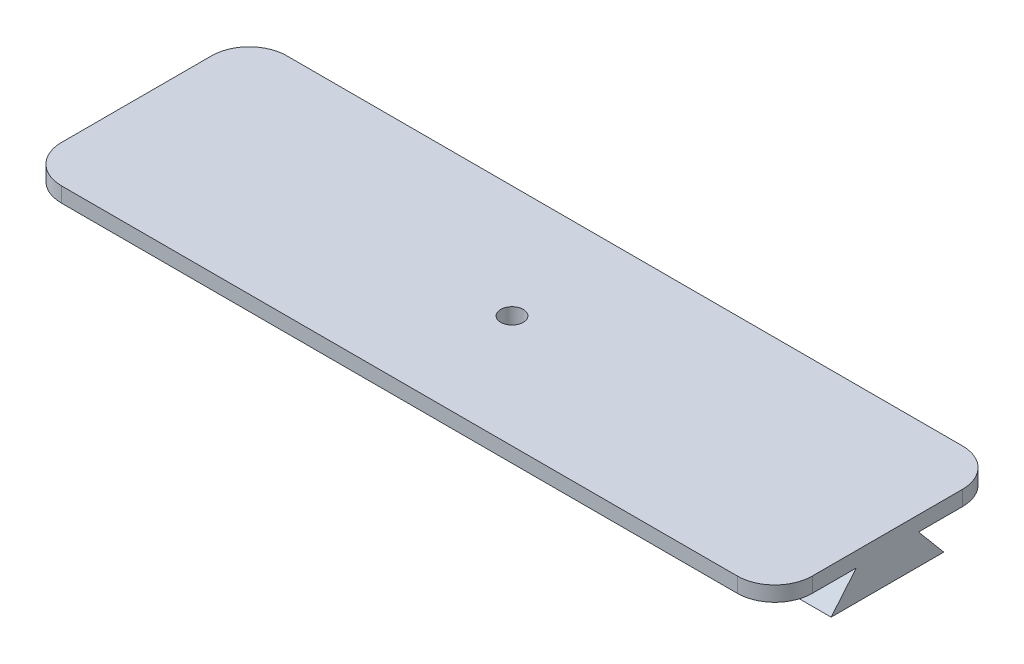
ISO-10303-21;
HEADER;
FILE_DESCRIPTION(('STEP AP214'),'2;1');
FILE_NAME('part.step','',(''),(''),'','','');
FILE_SCHEMA(('AUTOMOTIVE_DESIGN { 1 0 10303 214 1 1 1 1 }'));
ENDSEC;
DATA;
#1=APPLICATION_CONTEXT('core data for automotive mechanical design processes');
#2=APPLICATION_PROTOCOL_DEFINITION('international standard','automotive_design',2000,#1);
#3=PRODUCT_CONTEXT('',#1,'mechanical');
#4=PRODUCT('Part','Part','',(#3));
#5=PRODUCT_RELATED_PRODUCT_CATEGORY('part','',(#4));
#6=PRODUCT_DEFINITION_FORMATION('','',#4);
#7=PRODUCT_DEFINITION_CONTEXT('part definition',#1,'design');
#8=PRODUCT_DEFINITION('design','',#6,#7);
#9=PRODUCT_DEFINITION_SHAPE('','',#8);
#10=(LENGTH_UNIT() NAMED_UNIT(*) SI_UNIT(.MILLI.,.METRE.));
#11=(NAMED_UNIT(*) PLANE_ANGLE_UNIT() SI_UNIT($,.RADIAN.));
#12=(NAMED_UNIT(*) SI_UNIT($,.STERADIAN.) SOLID_ANGLE_UNIT());
#13=UNCERTAINTY_MEASURE_WITH_UNIT(LENGTH_MEASURE(1.E-05),#10,'distance_accuracy_value','');
#14=(GEOMETRIC_REPRESENTATION_CONTEXT(3) GLOBAL_UNCERTAINTY_ASSIGNED_CONTEXT((#13)) GLOBAL_UNIT_ASSIGNED_CONTEXT((#10,
#11,#12)) REPRESENTATION_CONTEXT('',''));
#15=CARTESIAN_POINT('',(0.,0.,0.));
#16=DIRECTION('',(0.,0.,1.));
#17=DIRECTION('',(1.,0.,0.));
#18=AXIS2_PLACEMENT_3D('',#15,#16,#17);
#19=CARTESIAN_POINT('',(0.,6.,0.));
#20=DIRECTION('',(1.,0.,0.));
#21=DIRECTION('',(0.,0.,-1.));
#22=AXIS2_PLACEMENT_3D('',#19,#20,#21);
#23=PLANE('',#22);
#24=DIRECTION('',(0.,0.,1.));
#25=VECTOR('',#24,1.);
#26=CARTESIAN_POINT('',(0.,4.,30.));
#27=LINE('',#26,#25);
#28=CARTESIAN_POINT('',(0.,4.,19.1436014752909));
#29=VERTEX_POINT('',#28);
#30=CARTESIAN_POINT('',(0.,4.,25.));
#31=VERTEX_POINT('',#30);
#32=EDGE_CURVE('E187',#29,#31,#27,.T.);
#33=ORIENTED_EDGE('',*,*,#32,.T.);
#34=DIRECTION('',(0.,-1.,0.));
#35=VECTOR('',#34,1.);
#36=CARTESIAN_POINT('',(0.,6.,25.));
#37=LINE('',#36,#35);
#38=CARTESIAN_POINT('',(0.,6.,25.));
#39=VERTEX_POINT('',#38);
#40=EDGE_CURVE('E11',#31,#39,#37,.F.);
#41=ORIENTED_EDGE('',*,*,#40,.T.);
#42=DIRECTION('',(0.,0.,1.));
#43=VECTOR('',#42,1.);
#44=CARTESIAN_POINT('',(0.,6.,0.));
#45=LINE('',#44,#43);
#46=CARTESIAN_POINT('',(0.,6.,5.));
#47=VERTEX_POINT('',#46);
#48=EDGE_CURVE('E195',#47,#39,#45,.T.);
#49=ORIENTED_EDGE('',*,*,#48,.F.);
#50=DIRECTION('',(0.,-1.,0.));
#51=VECTOR('',#50,1.);
#52=CARTESIAN_POINT('',(0.,6.,5.));
#53=LINE('',#52,#51);
#54=CARTESIAN_POINT('',(0.,4.,5.));
#55=VERTEX_POINT('',#54);
#56=EDGE_CURVE('E139',#47,#55,#53,.T.);
#57=ORIENTED_EDGE('',*,*,#56,.T.);
#58=DIRECTION('',(0.,0.,1.));
#59=VECTOR('',#58,1.);
#60=CARTESIAN_POINT('',(0.,4.,0.));
#61=LINE('',#60,#59);
#62=CARTESIAN_POINT('',(0.,4.,10.8563985247091));
#63=VERTEX_POINT('',#62);
#64=EDGE_CURVE('E131',#55,#63,#61,.T.);
#65=ORIENTED_EDGE('',*,*,#64,.T.);
#66=DIRECTION('',(0.,-0.766044443118979,-0.642787609686538));
#67=VECTOR('',#66,1.);
#68=CARTESIAN_POINT('',(0.,0.,7.5));
#69=LINE('',#68,#67);
#70=CARTESIAN_POINT('',(0.,0.,7.5));
#71=VERTEX_POINT('',#70);
#72=EDGE_CURVE('E135',#63,#71,#69,.T.);
#73=ORIENTED_EDGE('',*,*,#72,.T.);
#74=DIRECTION('',(0.,0.,1.));
#75=VECTOR('',#74,1.);
#76=CARTESIAN_POINT('',(0.,0.,0.));
#77=LINE('',#76,#75);
#78=CARTESIAN_POINT('',(0.,0.,22.5));
#79=VERTEX_POINT('',#78);
#80=EDGE_CURVE('E169',#71,#79,#77,.T.);
#81=ORIENTED_EDGE('',*,*,#80,.T.);
#82=DIRECTION('',(0.,0.766044443118979,-0.642787609686538));
#83=VECTOR('',#82,1.);
#84=CARTESIAN_POINT('',(0.,0.,22.5));
#85=LINE('',#84,#83);
#86=EDGE_CURVE('E175',#79,#29,#85,.T.);
#87=ORIENTED_EDGE('',*,*,#86,.T.);
#88=EDGE_LOOP('',(#33,#41,#49,#57,#65,#73,#81,#87));
#89=FACE_BOUND('',#88,.T.);
#90=ADVANCED_FACE('F41',(#89),#23,.F.);
#91=CARTESIAN_POINT('',(0.,6.,30.));
#92=DIRECTION('',(0.,0.,-1.));
#93=DIRECTION('',(-1.,0.,0.));
#94=AXIS2_PLACEMENT_3D('',#91,#92,#93);
#95=PLANE('',#94);
#96=DIRECTION('',(1.,0.,0.));
#97=VECTOR('',#96,1.);
#98=CARTESIAN_POINT('',(0.,4.,30.));
#99=LINE('',#98,#97);
#100=CARTESIAN_POINT('',(5.,4.,30.));
#101=VERTEX_POINT('',#100);
#102=CARTESIAN_POINT('',(95.,4.,30.));
#103=VERTEX_POINT('',#102);
#104=EDGE_CURVE('E172',#101,#103,#99,.T.);
#105=ORIENTED_EDGE('',*,*,#104,.T.);
#106=DIRECTION('',(0.,-1.,0.));
#107=VECTOR('',#106,1.);
#108=CARTESIAN_POINT('',(95.,6.,30.));
#109=LINE('',#108,#107);
#110=CARTESIAN_POINT('',(95.,6.,30.));
#111=VERTEX_POINT('',#110);
#112=EDGE_CURVE('E50',#103,#111,#109,.F.);
#113=ORIENTED_EDGE('',*,*,#112,.T.);
#114=DIRECTION('',(1.,0.,0.));
#115=VECTOR('',#114,1.);
#116=CARTESIAN_POINT('',(0.,6.,30.));
#117=LINE('',#116,#115);
#118=CARTESIAN_POINT('',(5.,6.,30.));
#119=VERTEX_POINT('',#118);
#120=EDGE_CURVE('E199',#119,#111,#117,.T.);
#121=ORIENTED_EDGE('',*,*,#120,.F.);
#122=DIRECTION('',(0.,-1.,0.));
#123=VECTOR('',#122,1.);
#124=CARTESIAN_POINT('',(5.,6.,30.));
#125=LINE('',#124,#123);
#126=EDGE_CURVE('E255',#119,#101,#125,.T.);
#127=ORIENTED_EDGE('',*,*,#126,.T.);
#128=EDGE_LOOP('',(#105,#113,#121,#127));
#129=FACE_BOUND('',#128,.T.);
#130=ADVANCED_FACE('F262',(#129),#95,.F.);
#131=CARTESIAN_POINT('',(100.,6.,0.));
#132=DIRECTION('',(-1.,0.,0.));
#133=DIRECTION('',(0.,0.,1.));
#134=AXIS2_PLACEMENT_3D('',#131,#132,#133);
#135=PLANE('',#134);
#136=DIRECTION('',(0.,0.,1.));
#137=VECTOR('',#136,1.);
#138=CARTESIAN_POINT('',(100.,4.,0.));
#139=LINE('',#138,#137);
#140=CARTESIAN_POINT('',(100.,4.,5.));
#141=VERTEX_POINT('',#140);
#142=CARTESIAN_POINT('',(100.,4.,10.8563985247091));
#143=VERTEX_POINT('',#142);
#144=EDGE_CURVE('E149',#141,#143,#139,.T.);
#145=ORIENTED_EDGE('',*,*,#144,.F.);
#146=DIRECTION('',(0.,-1.,0.));
#147=VECTOR('',#146,1.);
#148=CARTESIAN_POINT('',(100.,6.,5.));
#149=LINE('',#148,#147);
#150=CARTESIAN_POINT('',(100.,6.,5.));
#151=VERTEX_POINT('',#150);
#152=EDGE_CURVE('E239',#141,#151,#149,.F.);
#153=ORIENTED_EDGE('',*,*,#152,.T.);
#154=DIRECTION('',(0.,0.,-1.));
#155=VECTOR('',#154,1.);
#156=CARTESIAN_POINT('',(100.,6.,0.));
#157=LINE('',#156,#155);
#158=CARTESIAN_POINT('',(100.,6.,25.));
#159=VERTEX_POINT('',#158);
#160=EDGE_CURVE('E204',#159,#151,#157,.T.);
#161=ORIENTED_EDGE('',*,*,#160,.F.);
#162=DIRECTION('',(0.,-1.,0.));
#163=VECTOR('',#162,1.);
#164=CARTESIAN_POINT('',(100.,6.,25.));
#165=LINE('',#164,#163);
#166=CARTESIAN_POINT('',(100.,4.,25.));
#167=VERTEX_POINT('',#166);
#168=EDGE_CURVE('E235',#159,#167,#165,.T.);
#169=ORIENTED_EDGE('',*,*,#168,.T.);
#170=DIRECTION('',(0.,0.,1.));
#171=VECTOR('',#170,1.);
#172=CARTESIAN_POINT('',(100.,4.,30.));
#173=LINE('',#172,#171);
#174=CARTESIAN_POINT('',(100.,4.,19.1436014752909));
#175=VERTEX_POINT('',#174);
#176=EDGE_CURVE('E163',#175,#167,#173,.T.);
#177=ORIENTED_EDGE('',*,*,#176,.F.);
#178=DIRECTION('',(0.,0.766044443118979,-0.642787609686538));
#179=VECTOR('',#178,1.);
#180=CARTESIAN_POINT('',(100.,0.,22.5));
#181=LINE('',#180,#179);
#182=CARTESIAN_POINT('',(100.,0.,22.5));
#183=VERTEX_POINT('',#182);
#184=EDGE_CURVE('E183',#183,#175,#181,.T.);
#185=ORIENTED_EDGE('',*,*,#184,.F.);
#186=DIRECTION('',(0.,0.,-1.));
#187=VECTOR('',#186,1.);
#188=CARTESIAN_POINT('',(100.,0.,0.));
#189=LINE('',#188,#187);
#190=CARTESIAN_POINT('',(100.,0.,7.5));
#191=VERTEX_POINT('',#190);
#192=EDGE_CURVE('E200',#183,#191,#189,.T.);
#193=ORIENTED_EDGE('',*,*,#192,.T.);
#194=DIRECTION('',(0.,-0.766044443118979,-0.642787609686538));
#195=VECTOR('',#194,1.);
#196=CARTESIAN_POINT('',(100.,0.,7.5));
#197=LINE('',#196,#195);
#198=EDGE_CURVE('E142',#143,#191,#197,.T.);
#199=ORIENTED_EDGE('',*,*,#198,.F.);
#200=EDGE_LOOP('',(#145,#153,#161,#169,#177,#185,#193,#199));
#201=FACE_BOUND('',#200,.T.);
#202=ADVANCED_FACE('F274',(#201),#135,.F.);
#203=CARTESIAN_POINT('',(0.,6.,0.));
#204=DIRECTION('',(0.,0.,1.));
#205=DIRECTION('',(1.,0.,0.));
#206=AXIS2_PLACEMENT_3D('',#203,#204,#205);
#207=PLANE('',#206);
#208=DIRECTION('',(-1.,0.,0.));
#209=VECTOR('',#208,1.);
#210=CARTESIAN_POINT('',(0.,6.,0.));
#211=LINE('',#210,#209);
#212=CARTESIAN_POINT('',(95.,6.,0.));
#213=VERTEX_POINT('',#212);
#214=CARTESIAN_POINT('',(5.,6.,0.));
#215=VERTEX_POINT('',#214);
#216=EDGE_CURVE('E208',#213,#215,#211,.T.);
#217=ORIENTED_EDGE('',*,*,#216,.F.);
#218=DIRECTION('',(0.,-1.,0.));
#219=VECTOR('',#218,1.);
#220=CARTESIAN_POINT('',(95.,6.,0.));
#221=LINE('',#220,#219);
#222=CARTESIAN_POINT('',(95.,4.,0.));
#223=VERTEX_POINT('',#222);
#224=EDGE_CURVE('E228',#213,#223,#221,.T.);
#225=ORIENTED_EDGE('',*,*,#224,.T.);
#226=DIRECTION('',(1.,0.,0.));
#227=VECTOR('',#226,1.);
#228=CARTESIAN_POINT('',(0.,4.,0.));
#229=LINE('',#228,#227);
#230=CARTESIAN_POINT('',(5.,4.,0.));
#231=VERTEX_POINT('',#230);
#232=EDGE_CURVE('E166',#231,#223,#229,.T.);
#233=ORIENTED_EDGE('',*,*,#232,.F.);
#234=DIRECTION('',(0.,-1.,0.));
#235=VECTOR('',#234,1.);
#236=CARTESIAN_POINT('',(5.,6.,0.));
#237=LINE('',#236,#235);
#238=EDGE_CURVE('E221',#231,#215,#237,.F.);
#239=ORIENTED_EDGE('',*,*,#238,.T.);
#240=EDGE_LOOP('',(#217,#225,#233,#239));
#241=FACE_BOUND('',#240,.T.);
#242=ADVANCED_FACE('F312',(#241),#207,.F.);
#243=CARTESIAN_POINT('',(0.,6.,0.));
#244=DIRECTION('',(0.,1.,0.));
#245=DIRECTION('',(0.,0.,1.));
#246=AXIS2_PLACEMENT_3D('',#243,#244,#245);
#247=PLANE('',#246);
#248=CARTESIAN_POINT('',(50.,6.,15.));
#249=DIRECTION('',(0.,1.,0.));
#250=DIRECTION('',(0.,0.,1.));
#251=AXIS2_PLACEMENT_3D('',#248,#249,#250);
#252=CIRCLE('',#251,1.5);
#253=CARTESIAN_POINT('',(50.,6.,16.5));
#254=VERTEX_POINT('',#253);
#255=EDGE_CURVE('E345',#254,#254,#252,.T.);
#256=ORIENTED_EDGE('',*,*,#255,.F.);
#257=EDGE_LOOP('',(#256));
#258=FACE_BOUND('',#257,.T.);
#259=ORIENTED_EDGE('',*,*,#160,.T.);
#260=CARTESIAN_POINT('',(95.,6.,5.));
#261=DIRECTION('',(0.,1.,0.));
#262=DIRECTION('',(0.,0.,1.));
#263=AXIS2_PLACEMENT_3D('',#260,#261,#262);
#264=CIRCLE('',#263,5.);
#265=EDGE_CURVE('E248',#151,#213,#264,.T.);
#266=ORIENTED_EDGE('',*,*,#265,.T.);
#267=ORIENTED_EDGE('',*,*,#216,.T.);
#268=CARTESIAN_POINT('',(5.,6.,5.));
#269=DIRECTION('',(0.,1.,0.));
#270=DIRECTION('',(0.,0.,1.));
#271=AXIS2_PLACEMENT_3D('',#268,#269,#270);
#272=CIRCLE('',#271,5.);
#273=EDGE_CURVE('E225',#215,#47,#272,.T.);
#274=ORIENTED_EDGE('',*,*,#273,.T.);
#275=ORIENTED_EDGE('',*,*,#48,.T.);
#276=CARTESIAN_POINT('',(5.,6.,25.));
#277=DIRECTION('',(0.,1.,0.));
#278=DIRECTION('',(0.,0.,1.));
#279=AXIS2_PLACEMENT_3D('',#276,#277,#278);
#280=CIRCLE('',#279,5.);
#281=EDGE_CURVE('E242',#39,#119,#280,.T.);
#282=ORIENTED_EDGE('',*,*,#281,.T.);
#283=ORIENTED_EDGE('',*,*,#120,.T.);
#284=CARTESIAN_POINT('',(95.,6.,25.));
#285=DIRECTION('',(0.,1.,0.));
#286=DIRECTION('',(0.,0.,1.));
#287=AXIS2_PLACEMENT_3D('',#284,#285,#286);
#288=CIRCLE('',#287,5.);
#289=EDGE_CURVE('E245',#111,#159,#288,.T.);
#290=ORIENTED_EDGE('',*,*,#289,.T.);
#291=EDGE_LOOP('',(#259,#266,#267,#274,#275,#282,#283,#290));
#292=FACE_BOUND('',#291,.T.);
#293=ADVANCED_FACE('F267',(#258,#292),#247,.T.);
#294=CARTESIAN_POINT('',(0.,0.,0.));
#295=DIRECTION('',(0.,1.,0.));
#296=DIRECTION('',(0.,0.,1.));
#297=AXIS2_PLACEMENT_3D('',#294,#295,#296);
#298=PLANE('',#297);
#299=CARTESIAN_POINT('',(50.,0.,15.));
#300=DIRECTION('',(0.,1.,0.));
#301=DIRECTION('',(0.,0.,1.));
#302=AXIS2_PLACEMENT_3D('',#299,#300,#301);
#303=CIRCLE('',#302,1.5);
#304=CARTESIAN_POINT('',(50.,0.,16.5));
#305=VERTEX_POINT('',#304);
#306=EDGE_CURVE('E182',#305,#305,#303,.T.);
#307=ORIENTED_EDGE('',*,*,#306,.T.);
#308=EDGE_LOOP('',(#307));
#309=FACE_BOUND('',#308,.T.);
#310=ORIENTED_EDGE('',*,*,#80,.F.);
#311=DIRECTION('',(1.,0.,0.));
#312=VECTOR('',#311,1.);
#313=CARTESIAN_POINT('',(0.,0.,7.5));
#314=LINE('',#313,#312);
#315=EDGE_CURVE('E153',#71,#191,#314,.T.);
#316=ORIENTED_EDGE('',*,*,#315,.T.);
#317=ORIENTED_EDGE('',*,*,#192,.F.);
#318=DIRECTION('',(1.,0.,0.));
#319=VECTOR('',#318,1.);
#320=CARTESIAN_POINT('',(0.,0.,22.5));
#321=LINE('',#320,#319);
#322=EDGE_CURVE('E176',#79,#183,#321,.T.);
#323=ORIENTED_EDGE('',*,*,#322,.F.);
#324=EDGE_LOOP('',(#310,#316,#317,#323));
#325=FACE_BOUND('',#324,.T.);
#326=ADVANCED_FACE('F282',(#309,#325),#298,.F.);
#327=CARTESIAN_POINT('',(0.,4.,30.));
#328=DIRECTION('',(0.,1.,0.));
#329=DIRECTION('',(0.,0.,1.));
#330=AXIS2_PLACEMENT_3D('',#327,#328,#329);
#331=PLANE('',#330);
#332=ORIENTED_EDGE('',*,*,#176,.T.);
#333=CARTESIAN_POINT('',(95.,4.,25.));
#334=DIRECTION('',(0.,1.,0.));
#335=DIRECTION('',(0.,0.,1.));
#336=AXIS2_PLACEMENT_3D('',#333,#334,#335);
#337=CIRCLE('',#336,5.);
#338=EDGE_CURVE('E63',#167,#103,#337,.F.);
#339=ORIENTED_EDGE('',*,*,#338,.T.);
#340=ORIENTED_EDGE('',*,*,#104,.F.);
#341=CARTESIAN_POINT('',(5.,4.,25.));
#342=DIRECTION('',(0.,1.,0.));
#343=DIRECTION('',(0.,0.,1.));
#344=AXIS2_PLACEMENT_3D('',#341,#342,#343);
#345=CIRCLE('',#344,5.);
#346=EDGE_CURVE('E57',#101,#31,#345,.F.);
#347=ORIENTED_EDGE('',*,*,#346,.T.);
#348=ORIENTED_EDGE('',*,*,#32,.F.);
#349=DIRECTION('',(1.,0.,0.));
#350=VECTOR('',#349,1.);
#351=CARTESIAN_POINT('',(0.,4.,19.1436014752909));
#352=LINE('',#351,#350);
#353=EDGE_CURVE('E179',#29,#175,#352,.T.);
#354=ORIENTED_EDGE('',*,*,#353,.T.);
#355=EDGE_LOOP('',(#332,#339,#340,#347,#348,#354));
#356=FACE_BOUND('',#355,.T.);
#357=ADVANCED_FACE('F276',(#356),#331,.F.);
#358=CARTESIAN_POINT('',(0.,0.,22.5));
#359=DIRECTION('',(0.,-0.642787609686538,-0.766044443118979));
#360=DIRECTION('',(0.,0.766044443118979,-0.642787609686538));
#361=AXIS2_PLACEMENT_3D('',#358,#359,#360);
#362=PLANE('',#361);
#363=ORIENTED_EDGE('',*,*,#184,.T.);
#364=ORIENTED_EDGE('',*,*,#353,.F.);
#365=ORIENTED_EDGE('',*,*,#86,.F.);
#366=ORIENTED_EDGE('',*,*,#322,.T.);
#367=EDGE_LOOP('',(#363,#364,#365,#366));
#368=FACE_BOUND('',#367,.T.);
#369=ADVANCED_FACE('F278',(#368),#362,.F.);
#370=CARTESIAN_POINT('',(0.,4.,0.));
#371=DIRECTION('',(0.,1.,0.));
#372=DIRECTION('',(0.,0.,1.));
#373=AXIS2_PLACEMENT_3D('',#370,#371,#372);
#374=PLANE('',#373);
#375=ORIENTED_EDGE('',*,*,#232,.T.);
#376=CARTESIAN_POINT('',(95.,4.,5.));
#377=DIRECTION('',(0.,1.,0.));
#378=DIRECTION('',(0.,0.,1.));
#379=AXIS2_PLACEMENT_3D('',#376,#377,#378);
#380=CIRCLE('',#379,5.);
#381=EDGE_CURVE('E232',#223,#141,#380,.F.);
#382=ORIENTED_EDGE('',*,*,#381,.T.);
#383=ORIENTED_EDGE('',*,*,#144,.T.);
#384=DIRECTION('',(1.,0.,0.));
#385=VECTOR('',#384,1.);
#386=CARTESIAN_POINT('',(0.,4.,10.8563985247091));
#387=LINE('',#386,#385);
#388=EDGE_CURVE('E145',#63,#143,#387,.T.);
#389=ORIENTED_EDGE('',*,*,#388,.F.);
#390=ORIENTED_EDGE('',*,*,#64,.F.);
#391=CARTESIAN_POINT('',(5.,4.,5.));
#392=DIRECTION('',(0.,1.,0.));
#393=DIRECTION('',(0.,0.,1.));
#394=AXIS2_PLACEMENT_3D('',#391,#392,#393);
#395=CIRCLE('',#394,5.);
#396=EDGE_CURVE('E218',#55,#231,#395,.F.);
#397=ORIENTED_EDGE('',*,*,#396,.T.);
#398=EDGE_LOOP('',(#375,#382,#383,#389,#390,#397));
#399=FACE_BOUND('',#398,.T.);
#400=ADVANCED_FACE('F147',(#399),#374,.F.);
#401=CARTESIAN_POINT('',(0.,0.,7.5));
#402=DIRECTION('',(0.,-0.642787609686538,0.766044443118979));
#403=DIRECTION('',(0.,-0.766044443118979,-0.642787609686538));
#404=AXIS2_PLACEMENT_3D('',#401,#402,#403);
#405=PLANE('',#404);
#406=ORIENTED_EDGE('',*,*,#198,.T.);
#407=ORIENTED_EDGE('',*,*,#315,.F.);
#408=ORIENTED_EDGE('',*,*,#72,.F.);
#409=ORIENTED_EDGE('',*,*,#388,.T.);
#410=EDGE_LOOP('',(#406,#407,#408,#409));
#411=FACE_BOUND('',#410,.T.);
#412=ADVANCED_FACE('F155',(#411),#405,.F.);
#413=CARTESIAN_POINT('',(50.,0.,15.));
#414=DIRECTION('',(0.,1.,0.));
#415=DIRECTION('',(0.,0.,1.));
#416=AXIS2_PLACEMENT_3D('',#413,#414,#415);
#417=CYLINDRICAL_SURFACE('',#416,1.5);
#418=ORIENTED_EDGE('',*,*,#306,.F.);
#419=EDGE_LOOP('',(#418));
#420=FACE_BOUND('',#419,.T.);
#421=ORIENTED_EDGE('',*,*,#255,.T.);
#422=EDGE_LOOP('',(#421));
#423=FACE_BOUND('',#422,.T.);
#424=ADVANCED_FACE('F301',(#420,#423),#417,.F.);
#425=CARTESIAN_POINT('',(5.,6.,5.));
#426=DIRECTION('',(0.,-1.,0.));
#427=DIRECTION('',(0.,0.,-1.));
#428=AXIS2_PLACEMENT_3D('',#425,#426,#427);
#429=CYLINDRICAL_SURFACE('',#428,5.);
#430=ORIENTED_EDGE('',*,*,#273,.F.);
#431=ORIENTED_EDGE('',*,*,#238,.F.);
#432=ORIENTED_EDGE('',*,*,#396,.F.);
#433=ORIENTED_EDGE('',*,*,#56,.F.);
#434=EDGE_LOOP('',(#430,#431,#432,#433));
#435=FACE_BOUND('',#434,.T.);
#436=ADVANCED_FACE('F298',(#435),#429,.T.);
#437=CARTESIAN_POINT('',(95.,6.,5.));
#438=DIRECTION('',(0.,-1.,0.));
#439=DIRECTION('',(0.,0.,-1.));
#440=AXIS2_PLACEMENT_3D('',#437,#438,#439);
#441=CYLINDRICAL_SURFACE('',#440,5.);
#442=ORIENTED_EDGE('',*,*,#265,.F.);
#443=ORIENTED_EDGE('',*,*,#152,.F.);
#444=ORIENTED_EDGE('',*,*,#381,.F.);
#445=ORIENTED_EDGE('',*,*,#224,.F.);
#446=EDGE_LOOP('',(#442,#443,#444,#445));
#447=FACE_BOUND('',#446,.T.);
#448=ADVANCED_FACE('F289',(#447),#441,.T.);
#449=CARTESIAN_POINT('',(95.,6.,25.));
#450=DIRECTION('',(0.,-1.,0.));
#451=DIRECTION('',(0.,0.,-1.));
#452=AXIS2_PLACEMENT_3D('',#449,#450,#451);
#453=CYLINDRICAL_SURFACE('',#452,5.);
#454=ORIENTED_EDGE('',*,*,#289,.F.);
#455=ORIENTED_EDGE('',*,*,#112,.F.);
#456=ORIENTED_EDGE('',*,*,#338,.F.);
#457=ORIENTED_EDGE('',*,*,#168,.F.);
#458=EDGE_LOOP('',(#454,#455,#456,#457));
#459=FACE_BOUND('',#458,.T.);
#460=ADVANCED_FACE('F271',(#459),#453,.T.);
#461=CARTESIAN_POINT('',(5.,6.,25.));
#462=DIRECTION('',(0.,-1.,0.));
#463=DIRECTION('',(0.,0.,-1.));
#464=AXIS2_PLACEMENT_3D('',#461,#462,#463);
#465=CYLINDRICAL_SURFACE('',#464,5.);
#466=ORIENTED_EDGE('',*,*,#281,.F.);
#467=ORIENTED_EDGE('',*,*,#40,.F.);
#468=ORIENTED_EDGE('',*,*,#346,.F.);
#469=ORIENTED_EDGE('',*,*,#126,.F.);
#470=EDGE_LOOP('',(#466,#467,#468,#469));
#471=FACE_BOUND('',#470,.T.);
#472=ADVANCED_FACE('F43',(#471),#465,.T.);
#473=CLOSED_SHELL('',(#90,#130,#202,#242,#293,#326,#357,#369,#400,#412,#424,#436,#448,#460,#472));
#474=MANIFOLD_SOLID_BREP('B2',#473);
#475=ADVANCED_BREP_SHAPE_REPRESENTATION('',(#18,#474),#14);
#476=SHAPE_DEFINITION_REPRESENTATION(#9,#475);
ENDSEC;
END-ISO-10303-21;
